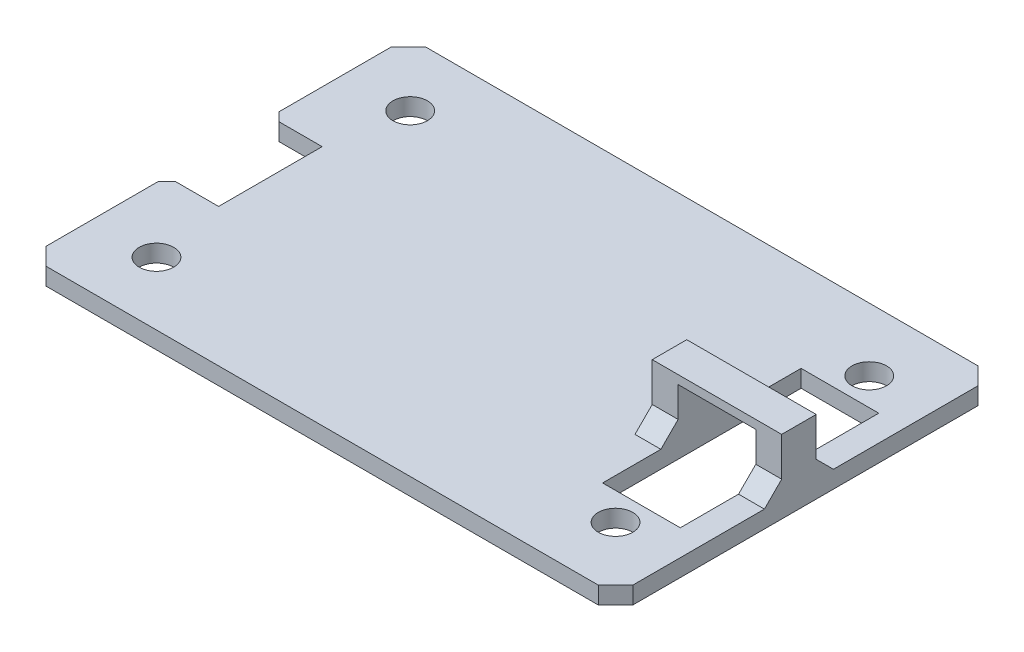
ISO-10303-21;
HEADER;
FILE_DESCRIPTION(('STEP AP214'),'2;1');
FILE_NAME('part.step','',(''),(''),'','','');
FILE_SCHEMA(('AUTOMOTIVE_DESIGN { 1 0 10303 214 1 1 1 1 }'));
ENDSEC;
DATA;
#1=APPLICATION_CONTEXT('core data for automotive mechanical design processes');
#2=APPLICATION_PROTOCOL_DEFINITION('international standard','automotive_design',2000,#1);
#3=PRODUCT_CONTEXT('',#1,'mechanical');
#4=PRODUCT('Part','Part','',(#3));
#5=PRODUCT_RELATED_PRODUCT_CATEGORY('part','',(#4));
#6=PRODUCT_DEFINITION_FORMATION('','',#4);
#7=PRODUCT_DEFINITION_CONTEXT('part definition',#1,'design');
#8=PRODUCT_DEFINITION('design','',#6,#7);
#9=PRODUCT_DEFINITION_SHAPE('','',#8);
#10=(LENGTH_UNIT() NAMED_UNIT(*) SI_UNIT(.MILLI.,.METRE.));
#11=(NAMED_UNIT(*) PLANE_ANGLE_UNIT() SI_UNIT($,.RADIAN.));
#12=(NAMED_UNIT(*) SI_UNIT($,.STERADIAN.) SOLID_ANGLE_UNIT());
#13=UNCERTAINTY_MEASURE_WITH_UNIT(LENGTH_MEASURE(1.E-05),#10,'distance_accuracy_value','');
#14=(GEOMETRIC_REPRESENTATION_CONTEXT(3) GLOBAL_UNCERTAINTY_ASSIGNED_CONTEXT((#13)) GLOBAL_UNIT_ASSIGNED_CONTEXT((#10,
#11,#12)) REPRESENTATION_CONTEXT('',''));
#15=CARTESIAN_POINT('',(0.,0.,0.));
#16=DIRECTION('',(0.,0.,1.));
#17=DIRECTION('',(1.,0.,0.));
#18=AXIS2_PLACEMENT_3D('',#15,#16,#17);
#19=CARTESIAN_POINT('',(-29.6080586080586,2.,-14.5531135531136));
#20=DIRECTION('',(1.,0.,0.));
#21=DIRECTION('',(0.,0.,-1.));
#22=AXIS2_PLACEMENT_3D('',#19,#20,#21);
#23=PLANE('',#22);
#24=DIRECTION('',(0.,0.,1.));
#25=VECTOR('',#24,1.);
#26=CARTESIAN_POINT('',(-29.6080586080586,2.,-14.5531135531136));
#27=LINE('',#26,#25);
#28=CARTESIAN_POINT('',(-29.6080586080586,2.,-12.5531135531136));
#29=VERTEX_POINT('',#28);
#30=CARTESIAN_POINT('',(-29.6080586080586,2.,0.446886446886447));
#31=VERTEX_POINT('',#30);
#32=EDGE_CURVE('E368',#29,#31,#27,.T.);
#33=ORIENTED_EDGE('',*,*,#32,.F.);
#34=DIRECTION('',(0.,-1.,0.));
#35=VECTOR('',#34,1.);
#36=CARTESIAN_POINT('',(-29.6080586080586,2.,-12.5531135531136));
#37=LINE('',#36,#35);
#38=CARTESIAN_POINT('',(-29.6080586080586,0.,-12.5531135531136));
#39=VERTEX_POINT('',#38);
#40=EDGE_CURVE('E41',#29,#39,#37,.T.);
#41=ORIENTED_EDGE('',*,*,#40,.T.);
#42=DIRECTION('',(0.,0.,1.));
#43=VECTOR('',#42,1.);
#44=CARTESIAN_POINT('',(-29.6080586080586,0.,-14.5531135531136));
#45=LINE('',#44,#43);
#46=CARTESIAN_POINT('',(-29.6080586080586,0.,0.446886446886447));
#47=VERTEX_POINT('',#46);
#48=EDGE_CURVE('E379',#39,#47,#45,.T.);
#49=ORIENTED_EDGE('',*,*,#48,.T.);
#50=DIRECTION('',(0.,1.,0.));
#51=VECTOR('',#50,1.);
#52=CARTESIAN_POINT('',(-29.6080586080586,2.,0.446886446886447));
#53=LINE('',#52,#51);
#54=EDGE_CURVE('E434',#47,#31,#53,.T.);
#55=ORIENTED_EDGE('',*,*,#54,.T.);
#56=EDGE_LOOP('',(#33,#41,#49,#55));
#57=FACE_BOUND('',#56,.T.);
#58=ADVANCED_FACE('F33',(#57),#23,.F.);
#59=CARTESIAN_POINT('',(26.3919413919414,0.,-4.05311355311355));
#60=DIRECTION('',(-1.,0.,0.));
#61=DIRECTION('',(0.,0.,1.));
#62=AXIS2_PLACEMENT_3D('',#59,#60,#61);
#63=PLANE('',#62);
#64=DIRECTION('',(0.,-1.,0.));
#65=VECTOR('',#64,1.);
#66=CARTESIAN_POINT('',(26.3919413919414,0.,6.19688644688645));
#67=LINE('',#66,#65);
#68=CARTESIAN_POINT('',(26.3919413919414,6.5,6.19688644688645));
#69=VERTEX_POINT('',#68);
#70=CARTESIAN_POINT('',(26.3919413919414,4.,6.19688644688645));
#71=VERTEX_POINT('',#70);
#72=EDGE_CURVE('E270',#69,#71,#67,.T.);
#73=ORIENTED_EDGE('',*,*,#72,.F.);
#74=DIRECTION('',(0.,0.,-1.));
#75=VECTOR('',#74,1.);
#76=CARTESIAN_POINT('',(26.3919413919414,6.5,10.1968864468864));
#77=LINE('',#76,#75);
#78=CARTESIAN_POINT('',(26.3919413919414,6.5,9.19688644688645));
#79=VERTEX_POINT('',#78);
#80=EDGE_CURVE('E292',#79,#69,#77,.T.);
#81=ORIENTED_EDGE('',*,*,#80,.F.);
#82=DIRECTION('',(0.,-0.707106781186548,-0.707106781186548));
#83=VECTOR('',#82,1.);
#84=CARTESIAN_POINT('',(26.3919413919414,-3.375,-0.678113553113553));
#85=LINE('',#84,#83);
#86=CARTESIAN_POINT('',(26.3919413919414,7.5,10.1968864468864));
#87=VERTEX_POINT('',#86);
#88=EDGE_CURVE('E457',#79,#87,#85,.F.);
#89=ORIENTED_EDGE('',*,*,#88,.T.);
#90=DIRECTION('',(0.,1.,0.));
#91=VECTOR('',#90,1.);
#92=CARTESIAN_POINT('',(26.3919413919414,0.,10.1968864468864));
#93=LINE('',#92,#91);
#94=CARTESIAN_POINT('',(26.3919413919414,4.00000000000001,10.1968864468864));
#95=VERTEX_POINT('',#94);
#96=EDGE_CURVE('E283',#95,#87,#93,.T.);
#97=ORIENTED_EDGE('',*,*,#96,.F.);
#98=DIRECTION('',(0.,-0.707106781186545,0.70710678118655));
#99=VECTOR('',#98,1.);
#100=CARTESIAN_POINT('',(26.3919413919414,9.12500000000001,5.07188644688641));
#101=LINE('',#100,#99);
#102=CARTESIAN_POINT('',(26.3919413919414,2.,12.1968864468865));
#103=VERTEX_POINT('',#102);
#104=EDGE_CURVE('E412',#95,#103,#101,.T.);
#105=ORIENTED_EDGE('',*,*,#104,.T.);
#106=DIRECTION('',(0.,0.,-1.));
#107=VECTOR('',#106,1.);
#108=CARTESIAN_POINT('',(26.3919413919414,2.,-4.05311355311355));
#109=LINE('',#108,#107);
#110=CARTESIAN_POINT('',(26.3919413919414,2.,18.9468864468864));
#111=VERTEX_POINT('',#110);
#112=EDGE_CURVE('E286',#111,#103,#109,.T.);
#113=ORIENTED_EDGE('',*,*,#112,.F.);
#114=DIRECTION('',(0.,1.,0.));
#115=VECTOR('',#114,1.);
#116=CARTESIAN_POINT('',(26.3919413919414,0.,18.9468864468864));
#117=LINE('',#116,#115);
#118=CARTESIAN_POINT('',(26.3919413919414,0.,18.9468864468864));
#119=VERTEX_POINT('',#118);
#120=EDGE_CURVE('E338',#119,#111,#117,.T.);
#121=ORIENTED_EDGE('',*,*,#120,.F.);
#122=DIRECTION('',(0.,0.,1.));
#123=VECTOR('',#122,1.);
#124=CARTESIAN_POINT('',(26.3919413919414,0.,-4.05311355311355));
#125=LINE('',#124,#123);
#126=CARTESIAN_POINT('',(26.3919413919414,0.,-4.05311355311355));
#127=VERTEX_POINT('',#126);
#128=EDGE_CURVE('E324',#127,#119,#125,.T.);
#129=ORIENTED_EDGE('',*,*,#128,.F.);
#130=DIRECTION('',(0.,1.,0.));
#131=VECTOR('',#130,1.);
#132=CARTESIAN_POINT('',(26.3919413919414,0.,-4.05311355311355));
#133=LINE('',#132,#131);
#134=CARTESIAN_POINT('',(26.3919413919414,2.,-4.05311355311355));
#135=VERTEX_POINT('',#134);
#136=EDGE_CURVE('E331',#127,#135,#133,.T.);
#137=ORIENTED_EDGE('',*,*,#136,.T.);
#138=DIRECTION('',(0.,0.,1.));
#139=VECTOR('',#138,1.);
#140=CARTESIAN_POINT('',(26.3919413919414,2.,-4.05311355311355));
#141=LINE('',#140,#139);
#142=CARTESIAN_POINT('',(26.3919413919414,2.,4.19688644688646));
#143=VERTEX_POINT('',#142);
#144=EDGE_CURVE('E333',#135,#143,#141,.T.);
#145=ORIENTED_EDGE('',*,*,#144,.T.);
#146=DIRECTION('',(0.,0.707106781186551,0.707106781186544));
#147=VECTOR('',#146,1.);
#148=CARTESIAN_POINT('',(26.3919413919414,-3.12500000000002,-0.928113553113502));
#149=LINE('',#148,#147);
#150=EDGE_CURVE('E426',#143,#71,#149,.T.);
#151=ORIENTED_EDGE('',*,*,#150,.T.);
#152=EDGE_LOOP('',(#73,#81,#89,#97,#105,#113,#121,#129,#137,#145,#151));
#153=FACE_BOUND('',#152,.T.);
#154=ADVANCED_FACE('F558',(#153),#63,.F.);
#155=CARTESIAN_POINT('',(35.3919413919414,0.,-4.05311355311355));
#156=DIRECTION('',(-1.,0.,0.));
#157=DIRECTION('',(0.,0.,1.));
#158=AXIS2_PLACEMENT_3D('',#155,#156,#157);
#159=PLANE('',#158);
#160=DIRECTION('',(0.,1.,0.));
#161=VECTOR('',#160,1.);
#162=CARTESIAN_POINT('',(35.3919413919414,0.,10.1968864468864));
#163=LINE('',#162,#161);
#164=CARTESIAN_POINT('',(35.3919413919414,4.00000000000001,10.1968864468864));
#165=VERTEX_POINT('',#164);
#166=CARTESIAN_POINT('',(35.3919413919414,7.5,10.1968864468864));
#167=VERTEX_POINT('',#166);
#168=EDGE_CURVE('E281',#165,#167,#163,.T.);
#169=ORIENTED_EDGE('',*,*,#168,.T.);
#170=DIRECTION('',(0.,0.707106781186548,0.707106781186548));
#171=VECTOR('',#170,1.);
#172=CARTESIAN_POINT('',(35.3919413919414,6.5,9.19688644688644));
#173=LINE('',#172,#171);
#174=CARTESIAN_POINT('',(35.3919413919414,6.5,9.19688644688645));
#175=VERTEX_POINT('',#174);
#176=EDGE_CURVE('E460',#167,#175,#173,.F.);
#177=ORIENTED_EDGE('',*,*,#176,.T.);
#178=DIRECTION('',(0.,0.,-1.));
#179=VECTOR('',#178,1.);
#180=CARTESIAN_POINT('',(35.3919413919414,6.5,-4.05311355311355));
#181=LINE('',#180,#179);
#182=CARTESIAN_POINT('',(35.3919413919414,6.5,6.19688644688645));
#183=VERTEX_POINT('',#182);
#184=EDGE_CURVE('E378',#175,#183,#181,.T.);
#185=ORIENTED_EDGE('',*,*,#184,.T.);
#186=DIRECTION('',(0.,-1.,0.));
#187=VECTOR('',#186,1.);
#188=CARTESIAN_POINT('',(35.3919413919414,0.,6.19688644688644));
#189=LINE('',#188,#187);
#190=CARTESIAN_POINT('',(35.3919413919414,4.00000000000002,6.19688644688644));
#191=VERTEX_POINT('',#190);
#192=EDGE_CURVE('E266',#183,#191,#189,.T.);
#193=ORIENTED_EDGE('',*,*,#192,.T.);
#194=DIRECTION('',(0.,-0.707106781186551,-0.707106781186544));
#195=VECTOR('',#194,1.);
#196=CARTESIAN_POINT('',(35.3919413919414,4.00000000000002,6.19688644688645));
#197=LINE('',#196,#195);
#198=CARTESIAN_POINT('',(35.3919413919414,2.,4.19688644688645));
#199=VERTEX_POINT('',#198);
#200=EDGE_CURVE('E419',#191,#199,#197,.T.);
#201=ORIENTED_EDGE('',*,*,#200,.T.);
#202=DIRECTION('',(0.,0.,-1.));
#203=VECTOR('',#202,1.);
#204=CARTESIAN_POINT('',(35.3919413919414,2.,-4.05311355311355));
#205=LINE('',#204,#203);
#206=CARTESIAN_POINT('',(35.3919413919414,2.,-4.05311355311355));
#207=VERTEX_POINT('',#206);
#208=EDGE_CURVE('E278',#199,#207,#205,.T.);
#209=ORIENTED_EDGE('',*,*,#208,.T.);
#210=DIRECTION('',(0.,1.,0.));
#211=VECTOR('',#210,1.);
#212=CARTESIAN_POINT('',(35.3919413919414,0.,-4.05311355311355));
#213=LINE('',#212,#211);
#214=CARTESIAN_POINT('',(35.3919413919414,0.,-4.05311355311355));
#215=VERTEX_POINT('',#214);
#216=EDGE_CURVE('E314',#215,#207,#213,.T.);
#217=ORIENTED_EDGE('',*,*,#216,.F.);
#218=DIRECTION('',(0.,0.,1.));
#219=VECTOR('',#218,1.);
#220=CARTESIAN_POINT('',(35.3919413919414,0.,-4.05311355311355));
#221=LINE('',#220,#219);
#222=CARTESIAN_POINT('',(35.3919413919414,0.,18.9468864468864));
#223=VERTEX_POINT('',#222);
#224=EDGE_CURVE('E311',#215,#223,#221,.T.);
#225=ORIENTED_EDGE('',*,*,#224,.T.);
#226=DIRECTION('',(0.,1.,0.));
#227=VECTOR('',#226,1.);
#228=CARTESIAN_POINT('',(35.3919413919414,0.,18.9468864468864));
#229=LINE('',#228,#227);
#230=CARTESIAN_POINT('',(35.3919413919414,2.,18.9468864468864));
#231=VERTEX_POINT('',#230);
#232=EDGE_CURVE('E316',#223,#231,#229,.T.);
#233=ORIENTED_EDGE('',*,*,#232,.T.);
#234=DIRECTION('',(0.,0.,1.));
#235=VECTOR('',#234,1.);
#236=CARTESIAN_POINT('',(35.3919413919414,2.,-4.05311355311355));
#237=LINE('',#236,#235);
#238=CARTESIAN_POINT('',(35.3919413919414,2.,12.1968864468865));
#239=VERTEX_POINT('',#238);
#240=EDGE_CURVE('E310',#239,#231,#237,.T.);
#241=ORIENTED_EDGE('',*,*,#240,.F.);
#242=DIRECTION('',(0.,0.707106781186545,-0.70710678118655));
#243=VECTOR('',#242,1.);
#244=CARTESIAN_POINT('',(35.3919413919414,2.,12.1968864468865));
#245=LINE('',#244,#243);
#246=EDGE_CURVE('E414',#239,#165,#245,.T.);
#247=ORIENTED_EDGE('',*,*,#246,.T.);
#248=EDGE_LOOP('',(#169,#177,#185,#193,#201,#209,#217,#225,#233,#241,#247));
#249=FACE_BOUND('',#248,.T.);
#250=ADVANCED_FACE('F546',(#249),#159,.T.);
#251=CARTESIAN_POINT('',(38.3919413919414,2.,-14.5531135531136));
#252=DIRECTION('',(-1.,0.,0.));
#253=DIRECTION('',(0.,0.,1.));
#254=AXIS2_PLACEMENT_3D('',#251,#252,#253);
#255=PLANE('',#254);
#256=DIRECTION('',(0.,0.,-1.));
#257=VECTOR('',#256,1.);
#258=CARTESIAN_POINT('',(38.3919413919414,2.,-14.5531135531136));
#259=LINE('',#258,#257);
#260=CARTESIAN_POINT('',(38.3919413919414,2.,27.4468864468864));
#261=VERTEX_POINT('',#260);
#262=CARTESIAN_POINT('',(38.3919413919414,2.,12.1968864468865));
#263=VERTEX_POINT('',#262);
#264=EDGE_CURVE('E374',#261,#263,#259,.T.);
#265=ORIENTED_EDGE('',*,*,#264,.F.);
#266=DIRECTION('',(0.,-1.,0.));
#267=VECTOR('',#266,1.);
#268=CARTESIAN_POINT('',(38.3919413919414,2.,27.4468864468864));
#269=LINE('',#268,#267);
#270=CARTESIAN_POINT('',(38.3919413919414,0.,27.4468864468864));
#271=VERTEX_POINT('',#270);
#272=EDGE_CURVE('E464',#261,#271,#269,.T.);
#273=ORIENTED_EDGE('',*,*,#272,.T.);
#274=DIRECTION('',(0.,0.,-1.));
#275=VECTOR('',#274,1.);
#276=CARTESIAN_POINT('',(38.3919413919414,0.,-14.5531135531136));
#277=LINE('',#276,#275);
#278=CARTESIAN_POINT('',(38.3919413919414,0.,-12.5531135531136));
#279=VERTEX_POINT('',#278);
#280=EDGE_CURVE('E384',#271,#279,#277,.T.);
#281=ORIENTED_EDGE('',*,*,#280,.T.);
#282=DIRECTION('',(0.,1.,0.));
#283=VECTOR('',#282,1.);
#284=CARTESIAN_POINT('',(38.3919413919414,2.,-12.5531135531136));
#285=LINE('',#284,#283);
#286=CARTESIAN_POINT('',(38.3919413919414,2.,-12.5531135531136));
#287=VERTEX_POINT('',#286);
#288=EDGE_CURVE('E462',#279,#287,#285,.T.);
#289=ORIENTED_EDGE('',*,*,#288,.T.);
#290=CARTESIAN_POINT('',(38.3919413919414,2.,4.19688644688645));
#291=VERTEX_POINT('',#290);
#292=EDGE_CURVE('E373',#291,#287,#259,.T.);
#293=ORIENTED_EDGE('',*,*,#292,.F.);
#294=DIRECTION('',(0.,0.707106781186551,0.707106781186544));
#295=VECTOR('',#294,1.);
#296=CARTESIAN_POINT('',(38.3919413919414,-7.375,-5.17811355311346));
#297=LINE('',#296,#295);
#298=CARTESIAN_POINT('',(38.3919413919414,4.00000000000002,6.19688644688645));
#299=VERTEX_POINT('',#298);
#300=EDGE_CURVE('E421',#291,#299,#297,.T.);
#301=ORIENTED_EDGE('',*,*,#300,.T.);
#302=DIRECTION('',(0.,-1.,0.));
#303=VECTOR('',#302,1.);
#304=CARTESIAN_POINT('',(38.3919413919414,2.,6.19688644688645));
#305=LINE('',#304,#303);
#306=CARTESIAN_POINT('',(38.3919413919414,8.5,6.19688644688645));
#307=VERTEX_POINT('',#306);
#308=EDGE_CURVE('E275',#307,#299,#305,.T.);
#309=ORIENTED_EDGE('',*,*,#308,.F.);
#310=DIRECTION('',(0.,0.,-1.));
#311=VECTOR('',#310,1.);
#312=CARTESIAN_POINT('',(38.3919413919414,8.5,-4.05311355311355));
#313=LINE('',#312,#311);
#314=CARTESIAN_POINT('',(38.3919413919414,8.5,10.1968864468864));
#315=VERTEX_POINT('',#314);
#316=EDGE_CURVE('E306',#315,#307,#313,.T.);
#317=ORIENTED_EDGE('',*,*,#316,.F.);
#318=DIRECTION('',(0.,1.,0.));
#319=VECTOR('',#318,1.);
#320=CARTESIAN_POINT('',(38.3919413919414,2.,10.1968864468864));
#321=LINE('',#320,#319);
#322=CARTESIAN_POINT('',(38.3919413919414,4.00000000000001,10.1968864468864));
#323=VERTEX_POINT('',#322);
#324=EDGE_CURVE('E284',#323,#315,#321,.T.);
#325=ORIENTED_EDGE('',*,*,#324,.F.);
#326=DIRECTION('',(0.,-0.707106781186545,0.70710678118655));
#327=VECTOR('',#326,1.);
#328=CARTESIAN_POINT('',(38.3919413919414,15.375,-1.17811355311363));
#329=LINE('',#328,#327);
#330=EDGE_CURVE('E416',#323,#263,#329,.T.);
#331=ORIENTED_EDGE('',*,*,#330,.T.);
#332=EDGE_LOOP('',(#265,#273,#281,#289,#293,#301,#309,#317,#325,#331));
#333=FACE_BOUND('',#332,.T.);
#334=ADVANCED_FACE('F535',(#333),#255,.F.);
#335=CARTESIAN_POINT('',(0.,8.5,0.));
#336=DIRECTION('',(0.,1.,0.));
#337=DIRECTION('',(0.,0.,1.));
#338=AXIS2_PLACEMENT_3D('',#335,#336,#337);
#339=PLANE('',#338);
#340=ORIENTED_EDGE('',*,*,#316,.T.);
#341=DIRECTION('',(-1.,0.,0.));
#342=VECTOR('',#341,1.);
#343=CARTESIAN_POINT('',(36.3919413919414,8.5,6.19688644688645));
#344=LINE('',#343,#342);
#345=CARTESIAN_POINT('',(23.3919413919414,8.5,6.19688644688645));
#346=VERTEX_POINT('',#345);
#347=EDGE_CURVE('E297',#307,#346,#344,.T.);
#348=ORIENTED_EDGE('',*,*,#347,.T.);
#349=DIRECTION('',(0.,0.,1.));
#350=VECTOR('',#349,1.);
#351=CARTESIAN_POINT('',(23.3919413919414,8.5,18.9468864468864));
#352=LINE('',#351,#350);
#353=CARTESIAN_POINT('',(23.3919413919414,8.5,10.1968864468864));
#354=VERTEX_POINT('',#353);
#355=EDGE_CURVE('E304',#346,#354,#352,.T.);
#356=ORIENTED_EDGE('',*,*,#355,.T.);
#357=DIRECTION('',(-1.,0.,0.));
#358=VECTOR('',#357,1.);
#359=CARTESIAN_POINT('',(36.3919413919414,8.5,10.1968864468864));
#360=LINE('',#359,#358);
#361=EDGE_CURVE('E294',#315,#354,#360,.T.);
#362=ORIENTED_EDGE('',*,*,#361,.F.);
#363=EDGE_LOOP('',(#340,#348,#356,#362));
#364=FACE_BOUND('',#363,.T.);
#365=ADVANCED_FACE('F579',(#364),#339,.T.);
#366=CARTESIAN_POINT('',(23.3919413919414,8.5,18.9468864468864));
#367=DIRECTION('',(1.,0.,0.));
#368=DIRECTION('',(0.,0.,-1.));
#369=AXIS2_PLACEMENT_3D('',#366,#367,#368);
#370=PLANE('',#369);
#371=DIRECTION('',(0.,1.,0.));
#372=VECTOR('',#371,1.);
#373=CARTESIAN_POINT('',(23.3919413919414,8.5,6.19688644688645));
#374=LINE('',#373,#372);
#375=CARTESIAN_POINT('',(23.3919413919414,4.,6.19688644688645));
#376=VERTEX_POINT('',#375);
#377=EDGE_CURVE('E273',#376,#346,#374,.T.);
#378=ORIENTED_EDGE('',*,*,#377,.F.);
#379=DIRECTION('',(0.,-0.707106781186551,-0.707106781186544));
#380=VECTOR('',#379,1.);
#381=CARTESIAN_POINT('',(23.3919413919414,12.625,14.8218864468864));
#382=LINE('',#381,#380);
#383=CARTESIAN_POINT('',(23.3919413919414,2.,4.19688644688647));
#384=VERTEX_POINT('',#383);
#385=EDGE_CURVE('E423',#376,#384,#382,.T.);
#386=ORIENTED_EDGE('',*,*,#385,.T.);
#387=DIRECTION('',(0.,0.,1.));
#388=VECTOR('',#387,1.);
#389=CARTESIAN_POINT('',(23.3919413919414,2.,18.9468864468864));
#390=LINE('',#389,#388);
#391=CARTESIAN_POINT('',(23.3919413919414,2.,12.1968864468865));
#392=VERTEX_POINT('',#391);
#393=EDGE_CURVE('E303',#384,#392,#390,.T.);
#394=ORIENTED_EDGE('',*,*,#393,.T.);
#395=DIRECTION('',(0.,0.707106781186545,-0.70710678118655));
#396=VECTOR('',#395,1.);
#397=CARTESIAN_POINT('',(23.3919413919414,1.87499999999999,12.3218864468865));
#398=LINE('',#397,#396);
#399=CARTESIAN_POINT('',(23.3919413919414,4.00000000000001,10.1968864468864));
#400=VERTEX_POINT('',#399);
#401=EDGE_CURVE('E410',#392,#400,#398,.T.);
#402=ORIENTED_EDGE('',*,*,#401,.T.);
#403=DIRECTION('',(0.,-1.,0.));
#404=VECTOR('',#403,1.);
#405=CARTESIAN_POINT('',(23.3919413919414,8.5,10.1968864468864));
#406=LINE('',#405,#404);
#407=EDGE_CURVE('E280',#354,#400,#406,.T.);
#408=ORIENTED_EDGE('',*,*,#407,.F.);
#409=ORIENTED_EDGE('',*,*,#355,.F.);
#410=EDGE_LOOP('',(#378,#386,#394,#402,#408,#409));
#411=FACE_BOUND('',#410,.T.);
#412=ADVANCED_FACE('F575',(#411),#370,.F.);
#413=CARTESIAN_POINT('',(0.,2.,0.));
#414=DIRECTION('',(0.,1.,0.));
#415=DIRECTION('',(0.,0.,1.));
#416=AXIS2_PLACEMENT_3D('',#413,#414,#415);
#417=PLANE('',#416);
#418=DIRECTION('',(1.,0.,0.));
#419=VECTOR('',#418,1.);
#420=CARTESIAN_POINT('',(-29.6080586080586,2.,29.4468864468864));
#421=LINE('',#420,#419);
#422=CARTESIAN_POINT('',(-27.6080586080586,2.,29.4468864468864));
#423=VERTEX_POINT('',#422);
#424=CARTESIAN_POINT('',(36.3919413919414,2.,29.4468864468864));
#425=VERTEX_POINT('',#424);
#426=EDGE_CURVE('E370',#423,#425,#421,.T.);
#427=ORIENTED_EDGE('',*,*,#426,.T.);
#428=DIRECTION('',(-0.707106781186549,0.,0.707106781186546));
#429=VECTOR('',#428,1.);
#430=CARTESIAN_POINT('',(32.9194139194138,2.,32.919413919414));
#431=LINE('',#430,#429);
#432=EDGE_CURVE('E485',#425,#261,#431,.F.);
#433=ORIENTED_EDGE('',*,*,#432,.T.);
#434=ORIENTED_EDGE('',*,*,#264,.T.);
#435=DIRECTION('',(-1.,0.,0.));
#436=VECTOR('',#435,1.);
#437=CARTESIAN_POINT('',(0.,2.,12.1968864468865));
#438=LINE('',#437,#436);
#439=EDGE_CURVE('E394',#263,#239,#438,.T.);
#440=ORIENTED_EDGE('',*,*,#439,.T.);
#441=ORIENTED_EDGE('',*,*,#240,.T.);
#442=DIRECTION('',(1.,0.,0.));
#443=VECTOR('',#442,1.);
#444=CARTESIAN_POINT('',(38.3919413919414,2.,18.9468864468864));
#445=LINE('',#444,#443);
#446=EDGE_CURVE('E325',#111,#231,#445,.T.);
#447=ORIENTED_EDGE('',*,*,#446,.F.);
#448=ORIENTED_EDGE('',*,*,#112,.T.);
#449=DIRECTION('',(-1.,0.,0.));
#450=VECTOR('',#449,1.);
#451=CARTESIAN_POINT('',(0.,2.,12.1968864468865));
#452=LINE('',#451,#450);
#453=EDGE_CURVE('E397',#103,#392,#452,.T.);
#454=ORIENTED_EDGE('',*,*,#453,.T.);
#455=ORIENTED_EDGE('',*,*,#393,.F.);
#456=DIRECTION('',(1.,0.,0.));
#457=VECTOR('',#456,1.);
#458=CARTESIAN_POINT('',(0.,2.,4.19688644688647));
#459=LINE('',#458,#457);
#460=EDGE_CURVE('E390',#384,#143,#459,.T.);
#461=ORIENTED_EDGE('',*,*,#460,.T.);
#462=ORIENTED_EDGE('',*,*,#144,.F.);
#463=DIRECTION('',(-1.,0.,0.));
#464=VECTOR('',#463,1.);
#465=CARTESIAN_POINT('',(38.3919413919414,2.,-4.05311355311355));
#466=LINE('',#465,#464);
#467=EDGE_CURVE('E319',#207,#135,#466,.T.);
#468=ORIENTED_EDGE('',*,*,#467,.F.);
#469=ORIENTED_EDGE('',*,*,#208,.F.);
#470=DIRECTION('',(1.,0.,0.));
#471=VECTOR('',#470,1.);
#472=CARTESIAN_POINT('',(0.,2.,4.19688644688646));
#473=LINE('',#472,#471);
#474=EDGE_CURVE('E392',#199,#291,#473,.T.);
#475=ORIENTED_EDGE('',*,*,#474,.T.);
#476=ORIENTED_EDGE('',*,*,#292,.T.);
#477=DIRECTION('',(0.707106781186548,0.,0.707106781186548));
#478=VECTOR('',#477,1.);
#479=CARTESIAN_POINT('',(25.4725274725275,2.,-25.4725274725275));
#480=LINE('',#479,#478);
#481=CARTESIAN_POINT('',(36.3919413919414,2.,-14.5531135531136));
#482=VERTEX_POINT('',#481);
#483=EDGE_CURVE('E55',#287,#482,#480,.F.);
#484=ORIENTED_EDGE('',*,*,#483,.T.);
#485=DIRECTION('',(-1.,0.,0.));
#486=VECTOR('',#485,1.);
#487=CARTESIAN_POINT('',(-29.6080586080586,2.,-14.5531135531136));
#488=LINE('',#487,#486);
#489=CARTESIAN_POINT('',(-27.6080586080586,2.,-14.5531135531136));
#490=VERTEX_POINT('',#489);
#491=EDGE_CURVE('E376',#482,#490,#488,.T.);
#492=ORIENTED_EDGE('',*,*,#491,.T.);
#493=DIRECTION('',(0.707106781186548,0.,-0.707106781186548));
#494=VECTOR('',#493,1.);
#495=CARTESIAN_POINT('',(-21.0805860805861,2.,-21.0805860805861));
#496=LINE('',#495,#494);
#497=EDGE_CURVE('E482',#490,#29,#496,.F.);
#498=ORIENTED_EDGE('',*,*,#497,.T.);
#499=ORIENTED_EDGE('',*,*,#32,.T.);
#500=DIRECTION('',(-0.707106781186548,0.,-0.707106781186548));
#501=VECTOR('',#500,1.);
#502=CARTESIAN_POINT('',(-15.0274725274725,2.,15.0274725274725));
#503=LINE('',#502,#501);
#504=CARTESIAN_POINT('',(-28.6080586080586,2.,1.44688644688645));
#505=VERTEX_POINT('',#504);
#506=EDGE_CURVE('E439',#31,#505,#503,.F.);
#507=ORIENTED_EDGE('',*,*,#506,.T.);
#508=DIRECTION('',(-1.,0.,0.));
#509=VECTOR('',#508,1.);
#510=CARTESIAN_POINT('',(-29.6080586080586,2.,1.44688644688645));
#511=LINE('',#510,#509);
#512=CARTESIAN_POINT('',(-23.6080586080586,2.,1.44688644688645));
#513=VERTEX_POINT('',#512);
#514=EDGE_CURVE('E257',#513,#505,#511,.T.);
#515=ORIENTED_EDGE('',*,*,#514,.F.);
#516=DIRECTION('',(0.,0.,-1.));
#517=VECTOR('',#516,1.);
#518=CARTESIAN_POINT('',(-23.6080586080586,2.,13.4468864468864));
#519=LINE('',#518,#517);
#520=CARTESIAN_POINT('',(-23.6080586080586,2.,13.4468864468864));
#521=VERTEX_POINT('',#520);
#522=EDGE_CURVE('E247',#521,#513,#519,.T.);
#523=ORIENTED_EDGE('',*,*,#522,.F.);
#524=DIRECTION('',(1.,0.,0.));
#525=VECTOR('',#524,1.);
#526=CARTESIAN_POINT('',(-29.6080586080586,2.,13.4468864468864));
#527=LINE('',#526,#525);
#528=CARTESIAN_POINT('',(-28.6080586080586,2.,13.4468864468864));
#529=VERTEX_POINT('',#528);
#530=EDGE_CURVE('E238',#529,#521,#527,.T.);
#531=ORIENTED_EDGE('',*,*,#530,.F.);
#532=DIRECTION('',(0.707106781186548,0.,-0.707106781186548));
#533=VECTOR('',#532,1.);
#534=CARTESIAN_POINT('',(-7.58058608058607,2.,-7.58058608058607));
#535=LINE('',#534,#533);
#536=CARTESIAN_POINT('',(-29.6080586080586,2.,14.4468864468865));
#537=VERTEX_POINT('',#536);
#538=EDGE_CURVE('E437',#529,#537,#535,.F.);
#539=ORIENTED_EDGE('',*,*,#538,.T.);
#540=CARTESIAN_POINT('',(-29.6080586080586,2.,27.4468864468864));
#541=VERTEX_POINT('',#540);
#542=EDGE_CURVE('E371',#537,#541,#27,.T.);
#543=ORIENTED_EDGE('',*,*,#542,.T.);
#544=DIRECTION('',(-0.707106781186548,0.,-0.707106781186548));
#545=VECTOR('',#544,1.);
#546=CARTESIAN_POINT('',(-28.5274725274725,2.,28.5274725274725));
#547=LINE('',#546,#545);
#548=EDGE_CURVE('E480',#541,#423,#547,.F.);
#549=ORIENTED_EDGE('',*,*,#548,.T.);
#550=EDGE_LOOP('',(#427,#433,#434,#440,#441,#447,#448,#454,#455,#461,#462,#468,#469,#475,#476,
#484,#492,#498,#499,#507,#515,#523,#531,#539,#543,#549));
#551=FACE_BOUND('',#550,.T.);
#552=CARTESIAN_POINT('',(31.0919413919414,2.,-7.25311355311355));
#553=DIRECTION('',(0.,1.,0.));
#554=DIRECTION('',(0.,0.,1.));
#555=AXIS2_PLACEMENT_3D('',#552,#553,#554);
#556=CIRCLE('',#555,2.);
#557=CARTESIAN_POINT('',(31.0919413919414,2.,-5.25311355311355));
#558=VERTEX_POINT('',#557);
#559=EDGE_CURVE('E348',#558,#558,#556,.T.);
#560=ORIENTED_EDGE('',*,*,#559,.F.);
#561=EDGE_LOOP('',(#560));
#562=FACE_BOUND('',#561,.T.);
#563=CARTESIAN_POINT('',(31.0919413919414,2.,22.1468864468864));
#564=DIRECTION('',(0.,1.,0.));
#565=DIRECTION('',(0.,0.,1.));
#566=AXIS2_PLACEMENT_3D('',#563,#564,#565);
#567=CIRCLE('',#566,2.00000000000001);
#568=CARTESIAN_POINT('',(31.0919413919414,2.,24.1468864468865));
#569=VERTEX_POINT('',#568);
#570=EDGE_CURVE('E354',#569,#569,#567,.T.);
#571=ORIENTED_EDGE('',*,*,#570,.F.);
#572=EDGE_LOOP('',(#571));
#573=FACE_BOUND('',#572,.T.);
#574=CARTESIAN_POINT('',(-22.1080586080586,2.,22.1468864468864));
#575=DIRECTION('',(0.,1.,0.));
#576=DIRECTION('',(0.,0.,1.));
#577=AXIS2_PLACEMENT_3D('',#574,#575,#576);
#578=CIRCLE('',#577,2.);
#579=CARTESIAN_POINT('',(-22.1080586080586,2.,24.1468864468864));
#580=VERTEX_POINT('',#579);
#581=EDGE_CURVE('E341',#580,#580,#578,.T.);
#582=ORIENTED_EDGE('',*,*,#581,.F.);
#583=EDGE_LOOP('',(#582));
#584=FACE_BOUND('',#583,.T.);
#585=CARTESIAN_POINT('',(-22.1080586080586,2.,-7.25311355311355));
#586=DIRECTION('',(0.,1.,0.));
#587=DIRECTION('',(0.,0.,1.));
#588=AXIS2_PLACEMENT_3D('',#585,#586,#587);
#589=CIRCLE('',#588,2.);
#590=CARTESIAN_POINT('',(-22.1080586080586,2.,-5.25311355311355));
#591=VERTEX_POINT('',#590);
#592=EDGE_CURVE('E347',#591,#591,#589,.T.);
#593=ORIENTED_EDGE('',*,*,#592,.F.);
#594=EDGE_LOOP('',(#593));
#595=FACE_BOUND('',#594,.T.);
#596=ADVANCED_FACE('F260',(#551,#562,#573,#584,#595),#417,.T.);
#597=CARTESIAN_POINT('',(-29.6080586080586,0.,14.4468864468865));
#598=VERTEX_POINT('',#597);
#599=CARTESIAN_POINT('',(-29.6080586080586,0.,27.4468864468864));
#600=VERTEX_POINT('',#599);
#601=EDGE_CURVE('E365',#598,#600,#45,.T.);
#602=ORIENTED_EDGE('',*,*,#601,.T.);
#603=DIRECTION('',(0.,1.,0.));
#604=VECTOR('',#603,1.);
#605=CARTESIAN_POINT('',(-29.6080586080586,2.,27.4468864468864));
#606=LINE('',#605,#604);
#607=EDGE_CURVE('E11',#600,#541,#606,.T.);
#608=ORIENTED_EDGE('',*,*,#607,.T.);
#609=ORIENTED_EDGE('',*,*,#542,.F.);
#610=DIRECTION('',(0.,-1.,0.));
#611=VECTOR('',#610,1.);
#612=CARTESIAN_POINT('',(-29.6080586080586,2.,14.4468864468865));
#613=LINE('',#612,#611);
#614=EDGE_CURVE('E449',#537,#598,#613,.T.);
#615=ORIENTED_EDGE('',*,*,#614,.T.);
#616=EDGE_LOOP('',(#602,#608,#609,#615));
#617=FACE_BOUND('',#616,.T.);
#618=ADVANCED_FACE('F520',(#617),#23,.F.);
#619=CARTESIAN_POINT('',(-29.6080586080586,2.,29.4468864468864));
#620=DIRECTION('',(0.,0.,-1.));
#621=DIRECTION('',(-1.,0.,0.));
#622=AXIS2_PLACEMENT_3D('',#619,#620,#621);
#623=PLANE('',#622);
#624=DIRECTION('',(1.,0.,0.));
#625=VECTOR('',#624,1.);
#626=CARTESIAN_POINT('',(-29.6080586080586,0.,29.4468864468864));
#627=LINE('',#626,#625);
#628=CARTESIAN_POINT('',(-27.6080586080586,0.,29.4468864468864));
#629=VERTEX_POINT('',#628);
#630=CARTESIAN_POINT('',(36.3919413919414,0.,29.4468864468864));
#631=VERTEX_POINT('',#630);
#632=EDGE_CURVE('E381',#629,#631,#627,.T.);
#633=ORIENTED_EDGE('',*,*,#632,.T.);
#634=DIRECTION('',(0.,1.,0.));
#635=VECTOR('',#634,1.);
#636=CARTESIAN_POINT('',(36.3919413919414,2.,29.4468864468864));
#637=LINE('',#636,#635);
#638=EDGE_CURVE('E478',#631,#425,#637,.T.);
#639=ORIENTED_EDGE('',*,*,#638,.T.);
#640=ORIENTED_EDGE('',*,*,#426,.F.);
#641=DIRECTION('',(0.,-1.,0.));
#642=VECTOR('',#641,1.);
#643=CARTESIAN_POINT('',(-27.6080586080586,2.,29.4468864468864));
#644=LINE('',#643,#642);
#645=EDGE_CURVE('E475',#423,#629,#644,.T.);
#646=ORIENTED_EDGE('',*,*,#645,.T.);
#647=EDGE_LOOP('',(#633,#639,#640,#646));
#648=FACE_BOUND('',#647,.T.);
#649=ADVANCED_FACE('F527',(#648),#623,.F.);
#650=CARTESIAN_POINT('',(-29.6080586080586,2.,-14.5531135531136));
#651=DIRECTION('',(0.,0.,1.));
#652=DIRECTION('',(1.,0.,0.));
#653=AXIS2_PLACEMENT_3D('',#650,#651,#652);
#654=PLANE('',#653);
#655=ORIENTED_EDGE('',*,*,#491,.F.);
#656=DIRECTION('',(0.,-1.,0.));
#657=VECTOR('',#656,1.);
#658=CARTESIAN_POINT('',(36.3919413919414,2.,-14.5531135531136));
#659=LINE('',#658,#657);
#660=CARTESIAN_POINT('',(36.3919413919414,0.,-14.5531135531136));
#661=VERTEX_POINT('',#660);
#662=EDGE_CURVE('E488',#482,#661,#659,.T.);
#663=ORIENTED_EDGE('',*,*,#662,.T.);
#664=DIRECTION('',(-1.,0.,0.));
#665=VECTOR('',#664,1.);
#666=CARTESIAN_POINT('',(-29.6080586080586,0.,-14.5531135531136));
#667=LINE('',#666,#665);
#668=CARTESIAN_POINT('',(-27.6080586080586,0.,-14.5531135531136));
#669=VERTEX_POINT('',#668);
#670=EDGE_CURVE('E387',#661,#669,#667,.T.);
#671=ORIENTED_EDGE('',*,*,#670,.T.);
#672=DIRECTION('',(0.,1.,0.));
#673=VECTOR('',#672,1.);
#674=CARTESIAN_POINT('',(-27.6080586080586,2.,-14.5531135531136));
#675=LINE('',#674,#673);
#676=EDGE_CURVE('E48',#669,#490,#675,.T.);
#677=ORIENTED_EDGE('',*,*,#676,.T.);
#678=EDGE_LOOP('',(#655,#663,#671,#677));
#679=FACE_BOUND('',#678,.T.);
#680=ADVANCED_FACE('F606',(#679),#654,.F.);
#681=CARTESIAN_POINT('',(0.,0.,0.));
#682=DIRECTION('',(0.,1.,0.));
#683=DIRECTION('',(0.,0.,1.));
#684=AXIS2_PLACEMENT_3D('',#681,#682,#683);
#685=PLANE('',#684);
#686=ORIENTED_EDGE('',*,*,#280,.F.);
#687=DIRECTION('',(0.707106781186549,0.,-0.707106781186546));
#688=VECTOR('',#687,1.);
#689=CARTESIAN_POINT('',(38.3919413919414,0.,27.4468864468864));
#690=LINE('',#689,#688);
#691=EDGE_CURVE('E473',#271,#631,#690,.F.);
#692=ORIENTED_EDGE('',*,*,#691,.T.);
#693=ORIENTED_EDGE('',*,*,#632,.F.);
#694=DIRECTION('',(0.707106781186548,0.,0.707106781186548));
#695=VECTOR('',#694,1.);
#696=CARTESIAN_POINT('',(-27.6080586080586,0.,29.4468864468864));
#697=LINE('',#696,#695);
#698=EDGE_CURVE('E467',#629,#600,#697,.F.);
#699=ORIENTED_EDGE('',*,*,#698,.T.);
#700=ORIENTED_EDGE('',*,*,#601,.F.);
#701=DIRECTION('',(-0.707106781186548,0.,0.707106781186548));
#702=VECTOR('',#701,1.);
#703=CARTESIAN_POINT('',(-28.6080586080586,0.,13.4468864468864));
#704=LINE('',#703,#702);
#705=CARTESIAN_POINT('',(-28.6080586080586,0.,13.4468864468864));
#706=VERTEX_POINT('',#705);
#707=EDGE_CURVE('E443',#598,#706,#704,.F.);
#708=ORIENTED_EDGE('',*,*,#707,.T.);
#709=DIRECTION('',(1.,0.,0.));
#710=VECTOR('',#709,1.);
#711=CARTESIAN_POINT('',(0.,0.,13.4468864468864));
#712=LINE('',#711,#710);
#713=CARTESIAN_POINT('',(-23.6080586080586,0.,13.4468864468864));
#714=VERTEX_POINT('',#713);
#715=EDGE_CURVE('E428',#706,#714,#712,.T.);
#716=ORIENTED_EDGE('',*,*,#715,.T.);
#717=DIRECTION('',(0.,0.,-1.));
#718=VECTOR('',#717,1.);
#719=CARTESIAN_POINT('',(-23.6080586080586,0.,0.));
#720=LINE('',#719,#718);
#721=CARTESIAN_POINT('',(-23.6080586080586,0.,1.44688644688645));
#722=VERTEX_POINT('',#721);
#723=EDGE_CURVE('E255',#714,#722,#720,.T.);
#724=ORIENTED_EDGE('',*,*,#723,.T.);
#725=DIRECTION('',(-1.,0.,0.));
#726=VECTOR('',#725,1.);
#727=CARTESIAN_POINT('',(0.,0.,1.44688644688645));
#728=LINE('',#727,#726);
#729=CARTESIAN_POINT('',(-28.6080586080586,0.,1.44688644688645));
#730=VERTEX_POINT('',#729);
#731=EDGE_CURVE('E431',#722,#730,#728,.T.);
#732=ORIENTED_EDGE('',*,*,#731,.T.);
#733=DIRECTION('',(0.707106781186548,0.,0.707106781186548));
#734=VECTOR('',#733,1.);
#735=CARTESIAN_POINT('',(-29.6080586080586,0.,0.446886446886447));
#736=LINE('',#735,#734);
#737=EDGE_CURVE('E445',#730,#47,#736,.F.);
#738=ORIENTED_EDGE('',*,*,#737,.T.);
#739=ORIENTED_EDGE('',*,*,#48,.F.);
#740=DIRECTION('',(-0.707106781186548,0.,0.707106781186548));
#741=VECTOR('',#740,1.);
#742=CARTESIAN_POINT('',(-29.6080586080586,0.,-12.5531135531136));
#743=LINE('',#742,#741);
#744=EDGE_CURVE('E469',#39,#669,#743,.F.);
#745=ORIENTED_EDGE('',*,*,#744,.T.);
#746=ORIENTED_EDGE('',*,*,#670,.F.);
#747=DIRECTION('',(-0.707106781186548,0.,-0.707106781186548));
#748=VECTOR('',#747,1.);
#749=CARTESIAN_POINT('',(36.3919413919414,0.,-14.5531135531136));
#750=LINE('',#749,#748);
#751=EDGE_CURVE('E471',#661,#279,#750,.F.);
#752=ORIENTED_EDGE('',*,*,#751,.T.);
#753=EDGE_LOOP('',(#686,#692,#693,#699,#700,#708,#716,#724,#732,#738,#739,#745,#746,#752));
#754=FACE_BOUND('',#753,.T.);
#755=CARTESIAN_POINT('',(31.0919413919414,0.,-7.25311355311355));
#756=DIRECTION('',(0.,1.,0.));
#757=DIRECTION('',(0.,0.,1.));
#758=AXIS2_PLACEMENT_3D('',#755,#756,#757);
#759=CIRCLE('',#758,2.);
#760=CARTESIAN_POINT('',(31.0919413919414,0.,-5.25311355311355));
#761=VERTEX_POINT('',#760);
#762=EDGE_CURVE('E344',#761,#761,#759,.T.);
#763=ORIENTED_EDGE('',*,*,#762,.T.);
#764=EDGE_LOOP('',(#763));
#765=FACE_BOUND('',#764,.T.);
#766=CARTESIAN_POINT('',(31.0919413919414,0.,22.1468864468864));
#767=DIRECTION('',(0.,1.,0.));
#768=DIRECTION('',(0.,0.,1.));
#769=AXIS2_PLACEMENT_3D('',#766,#767,#768);
#770=CIRCLE('',#769,2.00000000000001);
#771=CARTESIAN_POINT('',(31.0919413919414,0.,24.1468864468865));
#772=VERTEX_POINT('',#771);
#773=EDGE_CURVE('E351',#772,#772,#770,.T.);
#774=ORIENTED_EDGE('',*,*,#773,.T.);
#775=EDGE_LOOP('',(#774));
#776=FACE_BOUND('',#775,.T.);
#777=CARTESIAN_POINT('',(-22.1080586080586,0.,22.1468864468864));
#778=DIRECTION('',(0.,1.,0.));
#779=DIRECTION('',(0.,0.,1.));
#780=AXIS2_PLACEMENT_3D('',#777,#778,#779);
#781=CIRCLE('',#780,2.);
#782=CARTESIAN_POINT('',(-22.1080586080586,0.,24.1468864468864));
#783=VERTEX_POINT('',#782);
#784=EDGE_CURVE('E357',#783,#783,#781,.T.);
#785=ORIENTED_EDGE('',*,*,#784,.T.);
#786=EDGE_LOOP('',(#785));
#787=FACE_BOUND('',#786,.T.);
#788=CARTESIAN_POINT('',(-22.1080586080586,0.,-7.25311355311355));
#789=DIRECTION('',(0.,1.,0.));
#790=DIRECTION('',(0.,0.,1.));
#791=AXIS2_PLACEMENT_3D('',#788,#789,#790);
#792=CIRCLE('',#791,2.);
#793=CARTESIAN_POINT('',(-22.1080586080586,0.,-5.25311355311355));
#794=VERTEX_POINT('',#793);
#795=EDGE_CURVE('E362',#794,#794,#792,.T.);
#796=ORIENTED_EDGE('',*,*,#795,.T.);
#797=EDGE_LOOP('',(#796));
#798=FACE_BOUND('',#797,.T.);
#799=ORIENTED_EDGE('',*,*,#128,.T.);
#800=DIRECTION('',(1.,0.,0.));
#801=VECTOR('',#800,1.);
#802=CARTESIAN_POINT('',(38.3919413919414,0.,18.9468864468864));
#803=LINE('',#802,#801);
#804=EDGE_CURVE('E328',#119,#223,#803,.T.);
#805=ORIENTED_EDGE('',*,*,#804,.T.);
#806=ORIENTED_EDGE('',*,*,#224,.F.);
#807=DIRECTION('',(-1.,0.,0.));
#808=VECTOR('',#807,1.);
#809=CARTESIAN_POINT('',(38.3919413919414,0.,-4.05311355311355));
#810=LINE('',#809,#808);
#811=EDGE_CURVE('E322',#215,#127,#810,.T.);
#812=ORIENTED_EDGE('',*,*,#811,.T.);
#813=EDGE_LOOP('',(#799,#805,#806,#812));
#814=FACE_BOUND('',#813,.T.);
#815=ADVANCED_FACE('F499',(#754,#765,#776,#787,#798,#814),#685,.F.);
#816=CARTESIAN_POINT('',(-22.1080586080586,0.,-7.25311355311355));
#817=DIRECTION('',(0.,1.,0.));
#818=DIRECTION('',(0.,0.,1.));
#819=AXIS2_PLACEMENT_3D('',#816,#817,#818);
#820=CYLINDRICAL_SURFACE('',#819,2.);
#821=ORIENTED_EDGE('',*,*,#795,.F.);
#822=EDGE_LOOP('',(#821));
#823=FACE_BOUND('',#822,.T.);
#824=ORIENTED_EDGE('',*,*,#592,.T.);
#825=EDGE_LOOP('',(#824));
#826=FACE_BOUND('',#825,.T.);
#827=ADVANCED_FACE('F634',(#823,#826),#820,.F.);
#828=CARTESIAN_POINT('',(-22.1080586080586,0.,22.1468864468864));
#829=DIRECTION('',(0.,1.,0.));
#830=DIRECTION('',(0.,0.,1.));
#831=AXIS2_PLACEMENT_3D('',#828,#829,#830);
#832=CYLINDRICAL_SURFACE('',#831,2.);
#833=ORIENTED_EDGE('',*,*,#784,.F.);
#834=EDGE_LOOP('',(#833));
#835=FACE_BOUND('',#834,.T.);
#836=ORIENTED_EDGE('',*,*,#581,.T.);
#837=EDGE_LOOP('',(#836));
#838=FACE_BOUND('',#837,.T.);
#839=ADVANCED_FACE('F660',(#835,#838),#832,.F.);
#840=CARTESIAN_POINT('',(31.0919413919414,0.,22.1468864468864));
#841=DIRECTION('',(0.,1.,0.));
#842=DIRECTION('',(0.,0.,1.));
#843=AXIS2_PLACEMENT_3D('',#840,#841,#842);
#844=CYLINDRICAL_SURFACE('',#843,2.00000000000001);
#845=ORIENTED_EDGE('',*,*,#773,.F.);
#846=EDGE_LOOP('',(#845));
#847=FACE_BOUND('',#846,.T.);
#848=ORIENTED_EDGE('',*,*,#570,.T.);
#849=EDGE_LOOP('',(#848));
#850=FACE_BOUND('',#849,.T.);
#851=ADVANCED_FACE('F657',(#847,#850),#844,.F.);
#852=CARTESIAN_POINT('',(31.0919413919414,0.,-7.25311355311355));
#853=DIRECTION('',(0.,1.,0.));
#854=DIRECTION('',(0.,0.,1.));
#855=AXIS2_PLACEMENT_3D('',#852,#853,#854);
#856=CYLINDRICAL_SURFACE('',#855,2.);
#857=ORIENTED_EDGE('',*,*,#762,.F.);
#858=EDGE_LOOP('',(#857));
#859=FACE_BOUND('',#858,.T.);
#860=ORIENTED_EDGE('',*,*,#559,.T.);
#861=EDGE_LOOP('',(#860));
#862=FACE_BOUND('',#861,.T.);
#863=ADVANCED_FACE('F651',(#859,#862),#856,.F.);
#864=CARTESIAN_POINT('',(38.3919413919414,0.,18.9468864468864));
#865=DIRECTION('',(0.,0.,1.));
#866=DIRECTION('',(1.,0.,0.));
#867=AXIS2_PLACEMENT_3D('',#864,#865,#866);
#868=PLANE('',#867);
#869=ORIENTED_EDGE('',*,*,#446,.T.);
#870=ORIENTED_EDGE('',*,*,#232,.F.);
#871=ORIENTED_EDGE('',*,*,#804,.F.);
#872=ORIENTED_EDGE('',*,*,#120,.T.);
#873=EDGE_LOOP('',(#869,#870,#871,#872));
#874=FACE_BOUND('',#873,.T.);
#875=ADVANCED_FACE('F552',(#874),#868,.F.);
#876=CARTESIAN_POINT('',(38.3919413919414,0.,-4.05311355311355));
#877=DIRECTION('',(0.,0.,-1.));
#878=DIRECTION('',(-1.,0.,0.));
#879=AXIS2_PLACEMENT_3D('',#876,#877,#878);
#880=PLANE('',#879);
#881=ORIENTED_EDGE('',*,*,#811,.F.);
#882=ORIENTED_EDGE('',*,*,#216,.T.);
#883=ORIENTED_EDGE('',*,*,#467,.T.);
#884=ORIENTED_EDGE('',*,*,#136,.F.);
#885=EDGE_LOOP('',(#881,#882,#883,#884));
#886=FACE_BOUND('',#885,.T.);
#887=ADVANCED_FACE('F561',(#886),#880,.F.);
#888=CARTESIAN_POINT('',(36.3919413919414,8.5,10.1968864468864));
#889=DIRECTION('',(0.,0.,-1.));
#890=DIRECTION('',(0.,1.,0.));
#891=AXIS2_PLACEMENT_3D('',#888,#889,#890);
#892=PLANE('',#891);
#893=ORIENTED_EDGE('',*,*,#96,.T.);
#894=DIRECTION('',(1.,0.,0.));
#895=VECTOR('',#894,1.);
#896=CARTESIAN_POINT('',(36.3919413919414,7.5,10.1968864468864));
#897=LINE('',#896,#895);
#898=EDGE_CURVE('E454',#87,#167,#897,.T.);
#899=ORIENTED_EDGE('',*,*,#898,.T.);
#900=ORIENTED_EDGE('',*,*,#168,.F.);
#901=DIRECTION('',(1.,0.,0.));
#902=VECTOR('',#901,1.);
#903=CARTESIAN_POINT('',(36.3919413919414,4.00000000000001,10.1968864468864));
#904=LINE('',#903,#902);
#905=EDGE_CURVE('E400',#165,#323,#904,.T.);
#906=ORIENTED_EDGE('',*,*,#905,.T.);
#907=ORIENTED_EDGE('',*,*,#324,.T.);
#908=ORIENTED_EDGE('',*,*,#361,.T.);
#909=ORIENTED_EDGE('',*,*,#407,.T.);
#910=DIRECTION('',(1.,0.,0.));
#911=VECTOR('',#910,1.);
#912=CARTESIAN_POINT('',(36.3919413919414,4.00000000000001,10.1968864468864));
#913=LINE('',#912,#911);
#914=EDGE_CURVE('E402',#400,#95,#913,.T.);
#915=ORIENTED_EDGE('',*,*,#914,.T.);
#916=EDGE_LOOP('',(#893,#899,#900,#906,#907,#908,#909,#915));
#917=FACE_BOUND('',#916,.T.);
#918=ADVANCED_FACE('F581',(#917),#892,.F.);
#919=CARTESIAN_POINT('',(36.3919413919414,6.5,10.1968864468864));
#920=DIRECTION('',(0.,1.,0.));
#921=DIRECTION('',(0.,0.,1.));
#922=AXIS2_PLACEMENT_3D('',#919,#920,#921);
#923=PLANE('',#922);
#924=ORIENTED_EDGE('',*,*,#184,.F.);
#925=DIRECTION('',(-1.,0.,0.));
#926=VECTOR('',#925,1.);
#927=CARTESIAN_POINT('',(36.3919413919414,6.5,9.19688644688644));
#928=LINE('',#927,#926);
#929=EDGE_CURVE('E451',#175,#79,#928,.T.);
#930=ORIENTED_EDGE('',*,*,#929,.T.);
#931=ORIENTED_EDGE('',*,*,#80,.T.);
#932=DIRECTION('',(-1.,0.,0.));
#933=VECTOR('',#932,1.);
#934=CARTESIAN_POINT('',(36.3919413919414,6.5,6.19688644688645));
#935=LINE('',#934,#933);
#936=EDGE_CURVE('E300',#183,#69,#935,.T.);
#937=ORIENTED_EDGE('',*,*,#936,.F.);
#938=EDGE_LOOP('',(#924,#930,#931,#937));
#939=FACE_BOUND('',#938,.T.);
#940=ADVANCED_FACE('F591',(#939),#923,.F.);
#941=CARTESIAN_POINT('',(36.3919413919414,8.5,6.19688644688645));
#942=DIRECTION('',(0.,0.,1.));
#943=DIRECTION('',(1.,0.,0.));
#944=AXIS2_PLACEMENT_3D('',#941,#942,#943);
#945=PLANE('',#944);
#946=ORIENTED_EDGE('',*,*,#308,.T.);
#947=DIRECTION('',(-1.,0.,0.));
#948=VECTOR('',#947,1.);
#949=CARTESIAN_POINT('',(36.3919413919414,4.00000000000002,6.19688644688645));
#950=LINE('',#949,#948);
#951=EDGE_CURVE('E407',#299,#191,#950,.T.);
#952=ORIENTED_EDGE('',*,*,#951,.T.);
#953=ORIENTED_EDGE('',*,*,#192,.F.);
#954=ORIENTED_EDGE('',*,*,#936,.T.);
#955=ORIENTED_EDGE('',*,*,#72,.T.);
#956=DIRECTION('',(-1.,0.,0.));
#957=VECTOR('',#956,1.);
#958=CARTESIAN_POINT('',(36.3919413919414,4.,6.19688644688645));
#959=LINE('',#958,#957);
#960=EDGE_CURVE('E404',#71,#376,#959,.T.);
#961=ORIENTED_EDGE('',*,*,#960,.T.);
#962=ORIENTED_EDGE('',*,*,#377,.T.);
#963=ORIENTED_EDGE('',*,*,#347,.F.);
#964=EDGE_LOOP('',(#946,#952,#953,#954,#955,#961,#962,#963));
#965=FACE_BOUND('',#964,.T.);
#966=ADVANCED_FACE('F572',(#965),#945,.F.);
#967=CARTESIAN_POINT('',(0.,2.,12.1968864468865));
#968=DIRECTION('',(0.,-0.70710678118655,-0.707106781186545));
#969=DIRECTION('',(-1.,0.,0.));
#970=AXIS2_PLACEMENT_3D('',#967,#968,#969);
#971=PLANE('',#970);
#972=ORIENTED_EDGE('',*,*,#104,.F.);
#973=ORIENTED_EDGE('',*,*,#914,.F.);
#974=ORIENTED_EDGE('',*,*,#401,.F.);
#975=ORIENTED_EDGE('',*,*,#453,.F.);
#976=EDGE_LOOP('',(#972,#973,#974,#975));
#977=FACE_BOUND('',#976,.T.);
#978=ADVANCED_FACE('F818',(#977),#971,.F.);
#979=CARTESIAN_POINT('',(0.,2.,12.1968864468865));
#980=DIRECTION('',(0.,-0.70710678118655,-0.707106781186545));
#981=DIRECTION('',(-1.,0.,0.));
#982=AXIS2_PLACEMENT_3D('',#979,#980,#981);
#983=PLANE('',#982);
#984=ORIENTED_EDGE('',*,*,#330,.F.);
#985=ORIENTED_EDGE('',*,*,#905,.F.);
#986=ORIENTED_EDGE('',*,*,#246,.F.);
#987=ORIENTED_EDGE('',*,*,#439,.F.);
#988=EDGE_LOOP('',(#984,#985,#986,#987));
#989=FACE_BOUND('',#988,.T.);
#990=ADVANCED_FACE('F542',(#989),#983,.F.);
#991=CARTESIAN_POINT('',(36.3919413919414,4.00000000000002,6.19688644688645));
#992=DIRECTION('',(0.,-0.707106781186544,0.707106781186551));
#993=DIRECTION('',(-1.,0.,0.));
#994=AXIS2_PLACEMENT_3D('',#991,#992,#993);
#995=PLANE('',#994);
#996=ORIENTED_EDGE('',*,*,#300,.F.);
#997=ORIENTED_EDGE('',*,*,#474,.F.);
#998=ORIENTED_EDGE('',*,*,#200,.F.);
#999=ORIENTED_EDGE('',*,*,#951,.F.);
#1000=EDGE_LOOP('',(#996,#997,#998,#999));
#1001=FACE_BOUND('',#1000,.T.);
#1002=ADVANCED_FACE('F599',(#1001),#995,.F.);
#1003=CARTESIAN_POINT('',(36.3919413919414,4.,6.19688644688645));
#1004=DIRECTION('',(0.,-0.707106781186544,0.707106781186551));
#1005=DIRECTION('',(-1.,0.,0.));
#1006=AXIS2_PLACEMENT_3D('',#1003,#1004,#1005);
#1007=PLANE('',#1006);
#1008=ORIENTED_EDGE('',*,*,#150,.F.);
#1009=ORIENTED_EDGE('',*,*,#460,.F.);
#1010=ORIENTED_EDGE('',*,*,#385,.F.);
#1011=ORIENTED_EDGE('',*,*,#960,.F.);
#1012=EDGE_LOOP('',(#1008,#1009,#1010,#1011));
#1013=FACE_BOUND('',#1012,.T.);
#1014=ADVANCED_FACE('F569',(#1013),#1007,.F.);
#1015=CARTESIAN_POINT('',(-29.6080586080586,-18.,1.44688644688645));
#1016=DIRECTION('',(0.,0.,-1.));
#1017=DIRECTION('',(-1.,0.,0.));
#1018=AXIS2_PLACEMENT_3D('',#1015,#1016,#1017);
#1019=PLANE('',#1018);
#1020=ORIENTED_EDGE('',*,*,#514,.T.);
#1021=DIRECTION('',(0.,-1.,0.));
#1022=VECTOR('',#1021,1.);
#1023=CARTESIAN_POINT('',(-28.6080586080586,-18.,1.44688644688645));
#1024=LINE('',#1023,#1022);
#1025=EDGE_CURVE('E441',#505,#730,#1024,.T.);
#1026=ORIENTED_EDGE('',*,*,#1025,.T.);
#1027=ORIENTED_EDGE('',*,*,#731,.F.);
#1028=DIRECTION('',(0.,1.,0.));
#1029=VECTOR('',#1028,1.);
#1030=CARTESIAN_POINT('',(-23.6080586080586,-18.,1.44688644688645));
#1031=LINE('',#1030,#1029);
#1032=EDGE_CURVE('E256',#722,#513,#1031,.T.);
#1033=ORIENTED_EDGE('',*,*,#1032,.T.);
#1034=EDGE_LOOP('',(#1020,#1026,#1027,#1033));
#1035=FACE_BOUND('',#1034,.T.);
#1036=ADVANCED_FACE('F509',(#1035),#1019,.F.);
#1037=CARTESIAN_POINT('',(-23.6080586080586,-18.,13.4468864468864));
#1038=DIRECTION('',(1.,0.,0.));
#1039=DIRECTION('',(0.,0.,-1.));
#1040=AXIS2_PLACEMENT_3D('',#1037,#1038,#1039);
#1041=PLANE('',#1040);
#1042=DIRECTION('',(0.,1.,0.));
#1043=VECTOR('',#1042,1.);
#1044=CARTESIAN_POINT('',(-23.6080586080586,-18.,13.4468864468864));
#1045=LINE('',#1044,#1043);
#1046=EDGE_CURVE('E242',#714,#521,#1045,.T.);
#1047=ORIENTED_EDGE('',*,*,#1046,.T.);
#1048=ORIENTED_EDGE('',*,*,#522,.T.);
#1049=ORIENTED_EDGE('',*,*,#1032,.F.);
#1050=ORIENTED_EDGE('',*,*,#723,.F.);
#1051=EDGE_LOOP('',(#1047,#1048,#1049,#1050));
#1052=FACE_BOUND('',#1051,.T.);
#1053=ADVANCED_FACE('F251',(#1052),#1041,.F.);
#1054=CARTESIAN_POINT('',(-29.6080586080586,-18.,13.4468864468864));
#1055=DIRECTION('',(0.,0.,1.));
#1056=DIRECTION('',(1.,0.,0.));
#1057=AXIS2_PLACEMENT_3D('',#1054,#1055,#1056);
#1058=PLANE('',#1057);
#1059=ORIENTED_EDGE('',*,*,#715,.F.);
#1060=DIRECTION('',(0.,1.,0.));
#1061=VECTOR('',#1060,1.);
#1062=CARTESIAN_POINT('',(-28.6080586080586,-18.,13.4468864468864));
#1063=LINE('',#1062,#1061);
#1064=EDGE_CURVE('E245',#706,#529,#1063,.T.);
#1065=ORIENTED_EDGE('',*,*,#1064,.T.);
#1066=ORIENTED_EDGE('',*,*,#530,.T.);
#1067=ORIENTED_EDGE('',*,*,#1046,.F.);
#1068=EDGE_LOOP('',(#1059,#1065,#1066,#1067));
#1069=FACE_BOUND('',#1068,.T.);
#1070=ADVANCED_FACE('F241',(#1069),#1058,.F.);
#1071=CARTESIAN_POINT('',(-29.6080586080586,2.,0.446886446886447));
#1072=DIRECTION('',(0.707106781186547,0.,-0.707106781186547));
#1073=DIRECTION('',(0.,1.,0.));
#1074=AXIS2_PLACEMENT_3D('',#1071,#1072,#1073);
#1075=PLANE('',#1074);
#1076=ORIENTED_EDGE('',*,*,#737,.F.);
#1077=ORIENTED_EDGE('',*,*,#1025,.F.);
#1078=ORIENTED_EDGE('',*,*,#506,.F.);
#1079=ORIENTED_EDGE('',*,*,#54,.F.);
#1080=EDGE_LOOP('',(#1076,#1077,#1078,#1079));
#1081=FACE_BOUND('',#1080,.T.);
#1082=ADVANCED_FACE('F507',(#1081),#1075,.F.);
#1083=CARTESIAN_POINT('',(-28.6080586080586,-18.,13.4468864468864));
#1084=DIRECTION('',(0.707106781186547,0.,0.707106781186547));
#1085=DIRECTION('',(0.,1.,0.));
#1086=AXIS2_PLACEMENT_3D('',#1083,#1084,#1085);
#1087=PLANE('',#1086);
#1088=ORIENTED_EDGE('',*,*,#707,.F.);
#1089=ORIENTED_EDGE('',*,*,#614,.F.);
#1090=ORIENTED_EDGE('',*,*,#538,.F.);
#1091=ORIENTED_EDGE('',*,*,#1064,.F.);
#1092=EDGE_LOOP('',(#1088,#1089,#1090,#1091));
#1093=FACE_BOUND('',#1092,.T.);
#1094=ADVANCED_FACE('F513',(#1093),#1087,.F.);
#1095=CARTESIAN_POINT('',(36.3919413919414,6.5,9.19688644688644));
#1096=DIRECTION('',(0.,0.707106781186547,-0.707106781186547));
#1097=DIRECTION('',(-1.,0.,0.));
#1098=AXIS2_PLACEMENT_3D('',#1095,#1096,#1097);
#1099=PLANE('',#1098);
#1100=ORIENTED_EDGE('',*,*,#176,.F.);
#1101=ORIENTED_EDGE('',*,*,#898,.F.);
#1102=ORIENTED_EDGE('',*,*,#88,.F.);
#1103=ORIENTED_EDGE('',*,*,#929,.F.);
#1104=EDGE_LOOP('',(#1100,#1101,#1102,#1103));
#1105=FACE_BOUND('',#1104,.T.);
#1106=ADVANCED_FACE('F593',(#1105),#1099,.F.);
#1107=CARTESIAN_POINT('',(38.3919413919414,2.,27.4468864468864));
#1108=DIRECTION('',(-0.707106781186546,0.,-0.707106781186549));
#1109=DIRECTION('',(0.,-1.,0.));
#1110=AXIS2_PLACEMENT_3D('',#1107,#1108,#1109);
#1111=PLANE('',#1110);
#1112=ORIENTED_EDGE('',*,*,#432,.F.);
#1113=ORIENTED_EDGE('',*,*,#638,.F.);
#1114=ORIENTED_EDGE('',*,*,#691,.F.);
#1115=ORIENTED_EDGE('',*,*,#272,.F.);
#1116=EDGE_LOOP('',(#1112,#1113,#1114,#1115));
#1117=FACE_BOUND('',#1116,.T.);
#1118=ADVANCED_FACE('F531',(#1117),#1111,.F.);
#1119=CARTESIAN_POINT('',(36.3919413919414,2.,-14.5531135531136));
#1120=DIRECTION('',(-0.707106781186547,0.,0.707106781186547));
#1121=DIRECTION('',(0.,-1.,0.));
#1122=AXIS2_PLACEMENT_3D('',#1119,#1120,#1121);
#1123=PLANE('',#1122);
#1124=ORIENTED_EDGE('',*,*,#483,.F.);
#1125=ORIENTED_EDGE('',*,*,#288,.F.);
#1126=ORIENTED_EDGE('',*,*,#751,.F.);
#1127=ORIENTED_EDGE('',*,*,#662,.F.);
#1128=EDGE_LOOP('',(#1124,#1125,#1126,#1127));
#1129=FACE_BOUND('',#1128,.T.);
#1130=ADVANCED_FACE('F604',(#1129),#1123,.F.);
#1131=CARTESIAN_POINT('',(-29.6080586080586,2.,-12.5531135531136));
#1132=DIRECTION('',(0.707106781186547,0.,0.707106781186547));
#1133=DIRECTION('',(0.,-1.,0.));
#1134=AXIS2_PLACEMENT_3D('',#1131,#1132,#1133);
#1135=PLANE('',#1134);
#1136=ORIENTED_EDGE('',*,*,#497,.F.);
#1137=ORIENTED_EDGE('',*,*,#676,.F.);
#1138=ORIENTED_EDGE('',*,*,#744,.F.);
#1139=ORIENTED_EDGE('',*,*,#40,.F.);
#1140=EDGE_LOOP('',(#1136,#1137,#1138,#1139));
#1141=FACE_BOUND('',#1140,.T.);
#1142=ADVANCED_FACE('F607',(#1141),#1135,.F.);
#1143=CARTESIAN_POINT('',(-27.6080586080586,2.,29.4468864468864));
#1144=DIRECTION('',(0.707106781186547,0.,-0.707106781186547));
#1145=DIRECTION('',(0.,-1.,0.));
#1146=AXIS2_PLACEMENT_3D('',#1143,#1144,#1145);
#1147=PLANE('',#1146);
#1148=ORIENTED_EDGE('',*,*,#548,.F.);
#1149=ORIENTED_EDGE('',*,*,#607,.F.);
#1150=ORIENTED_EDGE('',*,*,#698,.F.);
#1151=ORIENTED_EDGE('',*,*,#645,.F.);
#1152=EDGE_LOOP('',(#1148,#1149,#1150,#1151));
#1153=FACE_BOUND('',#1152,.T.);
#1154=ADVANCED_FACE('F35',(#1153),#1147,.F.);
#1155=CLOSED_SHELL('',(#58,#154,#250,#334,#365,#412,#596,#618,#649,#680,#815,#827,#839,#851,
#863,#875,#887,#918,#940,#966,#978,#990,#1002,#1014,#1036,#1053,#1070,#1082,#1094,#1106,#1118,
#1130,#1142,#1154));
#1156=MANIFOLD_SOLID_BREP('B2',#1155);
#1157=ADVANCED_BREP_SHAPE_REPRESENTATION('',(#18,#1156),#14);
#1158=SHAPE_DEFINITION_REPRESENTATION(#9,#1157);
ENDSEC;
END-ISO-10303-21;
